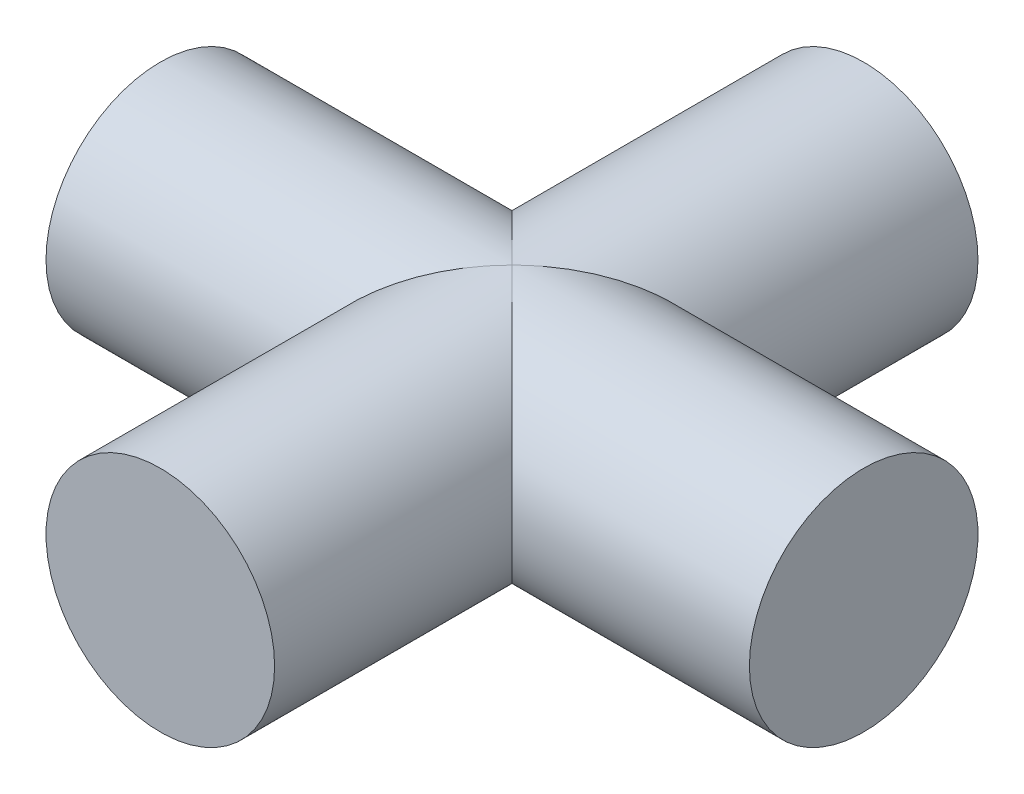
ISO-10303-21;
HEADER;
FILE_DESCRIPTION(('STEP AP214'),'2;1');
FILE_NAME('part.step','',(''),(''),'','','');
FILE_SCHEMA(('AUTOMOTIVE_DESIGN { 1 0 10303 214 1 1 1 1 }'));
ENDSEC;
DATA;
#1=APPLICATION_CONTEXT('core data for automotive mechanical design processes');
#2=APPLICATION_PROTOCOL_DEFINITION('international standard','automotive_design',2000,#1);
#3=PRODUCT_CONTEXT('',#1,'mechanical');
#4=PRODUCT('Part','Part','',(#3));
#5=PRODUCT_RELATED_PRODUCT_CATEGORY('part','',(#4));
#6=PRODUCT_DEFINITION_FORMATION('','',#4);
#7=PRODUCT_DEFINITION_CONTEXT('part definition',#1,'design');
#8=PRODUCT_DEFINITION('design','',#6,#7);
#9=PRODUCT_DEFINITION_SHAPE('','',#8);
#10=(LENGTH_UNIT() NAMED_UNIT(*) SI_UNIT(.MILLI.,.METRE.));
#11=(NAMED_UNIT(*) PLANE_ANGLE_UNIT() SI_UNIT($,.RADIAN.));
#12=(NAMED_UNIT(*) SI_UNIT($,.STERADIAN.) SOLID_ANGLE_UNIT());
#13=UNCERTAINTY_MEASURE_WITH_UNIT(LENGTH_MEASURE(1.E-05),#10,'distance_accuracy_value','');
#14=(GEOMETRIC_REPRESENTATION_CONTEXT(3) GLOBAL_UNCERTAINTY_ASSIGNED_CONTEXT((#13)) GLOBAL_UNIT_ASSIGNED_CONTEXT((#10,
#11,#12)) REPRESENTATION_CONTEXT('',''));
#15=CARTESIAN_POINT('',(0.,0.,0.));
#16=DIRECTION('',(0.,0.,1.));
#17=DIRECTION('',(1.,0.,0.));
#18=AXIS2_PLACEMENT_3D('',#15,#16,#17);
#19=CARTESIAN_POINT('',(0.,825.,-20.));
#20=DIRECTION('',(0.,0.,1.));
#21=DIRECTION('',(1.,0.,0.));
#22=AXIS2_PLACEMENT_3D('',#19,#20,#21);
#23=CYLINDRICAL_SURFACE('',#22,6.49999999999996);
#24=CARTESIAN_POINT('',(0.,825.,20.));
#25=DIRECTION('',(0.,0.,1.));
#26=DIRECTION('',(1.,0.,0.));
#27=AXIS2_PLACEMENT_3D('',#24,#25,#26);
#28=CIRCLE('',#27,6.49999999999996);
#29=CARTESIAN_POINT('',(6.49999999999998,825.,20.));
#30=VERTEX_POINT('',#29);
#31=EDGE_CURVE('E72',#30,#30,#28,.T.);
#32=ORIENTED_EDGE('',*,*,#31,.F.);
#33=EDGE_LOOP('',(#32));
#34=FACE_BOUND('',#33,.T.);
#35=CARTESIAN_POINT('',(0.,825.,0.));
#36=DIRECTION('',(-0.707106781186547,0.,0.707106781186547));
#37=DIRECTION('',(0.707106781186547,0.,0.707106781186547));
#38=AXIS2_PLACEMENT_3D('',#35,#36,#37);
#39=ELLIPSE('',#38,9.19238815542516,6.50000000000003);
#40=CARTESIAN_POINT('',(0.,818.5,0.));
#41=VERTEX_POINT('',#40);
#42=CARTESIAN_POINT('',(0.,831.5,0.));
#43=VERTEX_POINT('',#42);
#44=EDGE_CURVE('E60',#41,#43,#39,.T.);
#45=ORIENTED_EDGE('',*,*,#44,.T.);
#46=CARTESIAN_POINT('',(0.,825.,0.));
#47=DIRECTION('',(0.707106781186547,0.,0.707106781186547));
#48=DIRECTION('',(-0.707106781186547,0.,0.707106781186547));
#49=AXIS2_PLACEMENT_3D('',#46,#47,#48);
#50=ELLIPSE('',#49,9.19238815542516,6.50000000000003);
#51=EDGE_CURVE('E49',#43,#41,#50,.T.);
#52=ORIENTED_EDGE('',*,*,#51,.T.);
#53=EDGE_LOOP('',(#45,#52));
#54=FACE_BOUND('',#53,.T.);
#55=ADVANCED_FACE('F41',(#34,#54),#23,.T.);
#56=CARTESIAN_POINT('',(0.,825.,20.));
#57=DIRECTION('',(0.,0.,1.));
#58=DIRECTION('',(1.,0.,0.));
#59=AXIS2_PLACEMENT_3D('',#56,#57,#58);
#60=PLANE('',#59);
#61=ORIENTED_EDGE('',*,*,#31,.T.);
#62=EDGE_LOOP('',(#61));
#63=FACE_BOUND('',#62,.T.);
#64=ADVANCED_FACE('F93',(#63),#60,.T.);
#65=CARTESIAN_POINT('',(-20.,825.,0.));
#66=DIRECTION('',(-1.,0.,0.));
#67=DIRECTION('',(0.,0.,1.));
#68=AXIS2_PLACEMENT_3D('',#65,#66,#67);
#69=PLANE('',#68);
#70=CARTESIAN_POINT('',(-20.,825.,0.));
#71=DIRECTION('',(-1.,0.,0.));
#72=DIRECTION('',(0.,0.,1.));
#73=AXIS2_PLACEMENT_3D('',#70,#71,#72);
#74=CIRCLE('',#73,6.5000000000001);
#75=CARTESIAN_POINT('',(-20.,825.,6.50000000000009));
#76=VERTEX_POINT('',#75);
#77=EDGE_CURVE('E75',#76,#76,#74,.T.);
#78=ORIENTED_EDGE('',*,*,#77,.T.);
#79=EDGE_LOOP('',(#78));
#80=FACE_BOUND('',#79,.T.);
#81=ADVANCED_FACE('F84',(#80),#69,.T.);
#82=CARTESIAN_POINT('',(-20.,825.,0.));
#83=DIRECTION('',(1.,0.,0.));
#84=DIRECTION('',(0.,0.,-1.));
#85=AXIS2_PLACEMENT_3D('',#82,#83,#84);
#86=CYLINDRICAL_SURFACE('',#85,6.5000000000001);
#87=ORIENTED_EDGE('',*,*,#51,.F.);
#88=CARTESIAN_POINT('',(0.,825.,0.));
#89=DIRECTION('',(-0.707106781186547,0.,0.707106781186547));
#90=DIRECTION('',(0.707106781186547,0.,0.707106781186547));
#91=AXIS2_PLACEMENT_3D('',#88,#89,#90);
#92=ELLIPSE('',#91,9.19238815542516,6.50000000000003);
#93=EDGE_CURVE('E54',#41,#43,#92,.F.);
#94=ORIENTED_EDGE('',*,*,#93,.F.);
#95=EDGE_LOOP('',(#87,#94));
#96=FACE_BOUND('',#95,.T.);
#97=ORIENTED_EDGE('',*,*,#77,.F.);
#98=EDGE_LOOP('',(#97));
#99=FACE_BOUND('',#98,.T.);
#100=ADVANCED_FACE('F67',(#96,#99),#86,.T.);
#101=CARTESIAN_POINT('',(0.,825.,0.));
#102=DIRECTION('',(0.707106781186547,0.,0.707106781186547));
#103=DIRECTION('',(-0.707106781186547,0.,0.707106781186547));
#104=AXIS2_PLACEMENT_3D('',#101,#102,#103);
#105=ELLIPSE('',#104,9.19238815542516,6.50000000000003);
#106=EDGE_CURVE('E11',#43,#41,#105,.F.);
#107=ORIENTED_EDGE('',*,*,#106,.F.);
#108=ORIENTED_EDGE('',*,*,#44,.F.);
#109=EDGE_LOOP('',(#107,#108));
#110=FACE_BOUND('',#109,.T.);
#111=CARTESIAN_POINT('',(20.,825.,0.));
#112=DIRECTION('',(-1.,0.,0.));
#113=DIRECTION('',(0.,0.,1.));
#114=AXIS2_PLACEMENT_3D('',#111,#112,#113);
#115=CIRCLE('',#114,6.5000000000001);
#116=CARTESIAN_POINT('',(20.,825.,6.50000000000009));
#117=VERTEX_POINT('',#116);
#118=EDGE_CURVE('E78',#117,#117,#115,.T.);
#119=ORIENTED_EDGE('',*,*,#118,.T.);
#120=EDGE_LOOP('',(#119));
#121=FACE_BOUND('',#120,.T.);
#122=ADVANCED_FACE('F61',(#110,#121),#86,.T.);
#123=CARTESIAN_POINT('',(20.,825.,0.));
#124=DIRECTION('',(-1.,0.,0.));
#125=DIRECTION('',(0.,0.,1.));
#126=AXIS2_PLACEMENT_3D('',#123,#124,#125);
#127=PLANE('',#126);
#128=ORIENTED_EDGE('',*,*,#118,.F.);
#129=EDGE_LOOP('',(#128));
#130=FACE_BOUND('',#129,.T.);
#131=ADVANCED_FACE('F92',(#130),#127,.F.);
#132=CARTESIAN_POINT('',(0.,825.,-20.));
#133=DIRECTION('',(0.,0.,1.));
#134=DIRECTION('',(1.,0.,0.));
#135=AXIS2_PLACEMENT_3D('',#132,#133,#134);
#136=PLANE('',#135);
#137=CARTESIAN_POINT('',(0.,825.,-20.));
#138=DIRECTION('',(0.,0.,1.));
#139=DIRECTION('',(1.,0.,0.));
#140=AXIS2_PLACEMENT_3D('',#137,#138,#139);
#141=CIRCLE('',#140,6.49999999999996);
#142=CARTESIAN_POINT('',(6.49999999999998,825.,-20.));
#143=VERTEX_POINT('',#142);
#144=EDGE_CURVE('E69',#143,#143,#141,.T.);
#145=ORIENTED_EDGE('',*,*,#144,.F.);
#146=EDGE_LOOP('',(#145));
#147=FACE_BOUND('',#146,.T.);
#148=ADVANCED_FACE('F106',(#147),#136,.F.);
#149=ORIENTED_EDGE('',*,*,#144,.T.);
#150=EDGE_LOOP('',(#149));
#151=FACE_BOUND('',#150,.T.);
#152=ORIENTED_EDGE('',*,*,#93,.T.);
#153=ORIENTED_EDGE('',*,*,#106,.T.);
#154=EDGE_LOOP('',(#152,#153));
#155=FACE_BOUND('',#154,.T.);
#156=ADVANCED_FACE('F43',(#151,#155),#23,.T.);
#157=CLOSED_SHELL('',(#55,#64,#81,#100,#122,#131,#148,#156));
#158=MANIFOLD_SOLID_BREP('B2',#157);
#159=ADVANCED_BREP_SHAPE_REPRESENTATION('',(#18,#158),#14);
#160=SHAPE_DEFINITION_REPRESENTATION(#9,#159);
ENDSEC;
END-ISO-10303-21;
